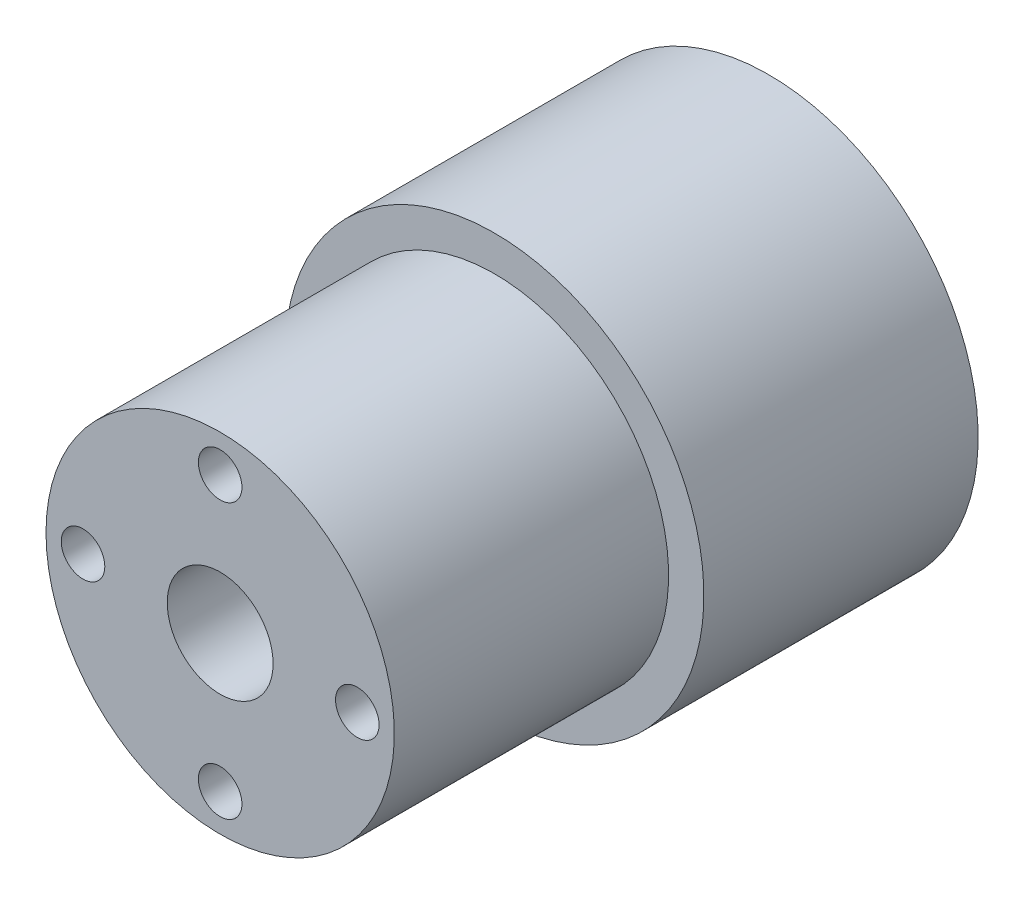
ISO-10303-21;
HEADER;
FILE_DESCRIPTION(('STEP AP214'),'2;1');
FILE_NAME('part.step','',(''),(''),'','','');
FILE_SCHEMA(('AUTOMOTIVE_DESIGN { 1 0 10303 214 1 1 1 1 }'));
ENDSEC;
DATA;
#1=APPLICATION_CONTEXT('core data for automotive mechanical design processes');
#2=APPLICATION_PROTOCOL_DEFINITION('international standard','automotive_design',2000,#1);
#3=PRODUCT_CONTEXT('',#1,'mechanical');
#4=PRODUCT('Part','Part','',(#3));
#5=PRODUCT_RELATED_PRODUCT_CATEGORY('part','',(#4));
#6=PRODUCT_DEFINITION_FORMATION('','',#4);
#7=PRODUCT_DEFINITION_CONTEXT('part definition',#1,'design');
#8=PRODUCT_DEFINITION('design','',#6,#7);
#9=PRODUCT_DEFINITION_SHAPE('','',#8);
#10=(LENGTH_UNIT() NAMED_UNIT(*) SI_UNIT(.MILLI.,.METRE.));
#11=(NAMED_UNIT(*) PLANE_ANGLE_UNIT() SI_UNIT($,.RADIAN.));
#12=(NAMED_UNIT(*) SI_UNIT($,.STERADIAN.) SOLID_ANGLE_UNIT());
#13=UNCERTAINTY_MEASURE_WITH_UNIT(LENGTH_MEASURE(1.E-05),#10,'distance_accuracy_value','');
#14=(GEOMETRIC_REPRESENTATION_CONTEXT(3) GLOBAL_UNCERTAINTY_ASSIGNED_CONTEXT((#13)) GLOBAL_UNIT_ASSIGNED_CONTEXT((#10,
#11,#12)) REPRESENTATION_CONTEXT('',''));
#15=CARTESIAN_POINT('',(0.,0.,0.));
#16=DIRECTION('',(0.,0.,1.));
#17=DIRECTION('',(1.,0.,0.));
#18=AXIS2_PLACEMENT_3D('',#15,#16,#17);
#19=CARTESIAN_POINT('',(0.,0.,0.));
#20=DIRECTION('',(0.,0.,-1.));
#21=DIRECTION('',(-1.,0.,0.));
#22=AXIS2_PLACEMENT_3D('',#19,#20,#21);
#23=PLANE('',#22);
#24=CARTESIAN_POINT('',(0.,0.,0.));
#25=DIRECTION('',(0.,0.,1.));
#26=DIRECTION('',(1.,0.,0.));
#27=AXIS2_PLACEMENT_3D('',#24,#25,#26);
#28=CIRCLE('',#27,2.8956);
#29=CARTESIAN_POINT('',(2.8956,0.,0.));
#30=VERTEX_POINT('',#29);
#31=EDGE_CURVE('E81',#30,#30,#28,.T.);
#32=ORIENTED_EDGE('',*,*,#31,.F.);
#33=EDGE_LOOP('',(#32));
#34=FACE_BOUND('',#33,.T.);
#35=CARTESIAN_POINT('',(-7.5,0.,0.));
#36=DIRECTION('',(0.,0.,1.));
#37=DIRECTION('',(1.,0.,0.));
#38=AXIS2_PLACEMENT_3D('',#35,#36,#37);
#39=CIRCLE('',#38,1.190625);
#40=CARTESIAN_POINT('',(-6.309375,0.,0.));
#41=VERTEX_POINT('',#40);
#42=EDGE_CURVE('E78',#41,#41,#39,.T.);
#43=ORIENTED_EDGE('',*,*,#42,.F.);
#44=EDGE_LOOP('',(#43));
#45=FACE_BOUND('',#44,.T.);
#46=CARTESIAN_POINT('',(0.,-7.5,0.));
#47=DIRECTION('',(0.,0.,1.));
#48=DIRECTION('',(1.,0.,0.));
#49=AXIS2_PLACEMENT_3D('',#46,#47,#48);
#50=CIRCLE('',#49,1.190625);
#51=CARTESIAN_POINT('',(1.190625,-7.5,0.));
#52=VERTEX_POINT('',#51);
#53=EDGE_CURVE('E70',#52,#52,#50,.T.);
#54=ORIENTED_EDGE('',*,*,#53,.F.);
#55=EDGE_LOOP('',(#54));
#56=FACE_BOUND('',#55,.T.);
#57=CARTESIAN_POINT('',(0.,7.5,0.));
#58=DIRECTION('',(0.,0.,1.));
#59=DIRECTION('',(1.,0.,0.));
#60=AXIS2_PLACEMENT_3D('',#57,#58,#59);
#61=CIRCLE('',#60,1.190625);
#62=CARTESIAN_POINT('',(1.190625,7.5,0.));
#63=VERTEX_POINT('',#62);
#64=EDGE_CURVE('E64',#63,#63,#61,.T.);
#65=ORIENTED_EDGE('',*,*,#64,.F.);
#66=EDGE_LOOP('',(#65));
#67=FACE_BOUND('',#66,.T.);
#68=CARTESIAN_POINT('',(7.5,0.,0.));
#69=DIRECTION('',(0.,0.,1.));
#70=DIRECTION('',(1.,0.,0.));
#71=AXIS2_PLACEMENT_3D('',#68,#69,#70);
#72=CIRCLE('',#71,1.190625);
#73=CARTESIAN_POINT('',(8.690625,0.,0.));
#74=VERTEX_POINT('',#73);
#75=EDGE_CURVE('E60',#74,#74,#72,.T.);
#76=ORIENTED_EDGE('',*,*,#75,.F.);
#77=EDGE_LOOP('',(#76));
#78=FACE_BOUND('',#77,.T.);
#79=CARTESIAN_POINT('',(0.,0.,0.));
#80=DIRECTION('',(0.,0.,-1.));
#81=DIRECTION('',(-1.,0.,0.));
#82=AXIS2_PLACEMENT_3D('',#79,#80,#81);
#83=CIRCLE('',#82,9.525);
#84=CARTESIAN_POINT('',(-9.525,0.,0.));
#85=VERTEX_POINT('',#84);
#86=EDGE_CURVE('E10',#85,#85,#83,.T.);
#87=ORIENTED_EDGE('',*,*,#86,.F.);
#88=EDGE_LOOP('',(#87));
#89=FACE_BOUND('',#88,.T.);
#90=ADVANCED_FACE('F40',(#34,#45,#56,#67,#78,#89),#23,.F.);
#91=CARTESIAN_POINT('',(0.,0.,-30.));
#92=DIRECTION('',(0.,0.,-1.));
#93=DIRECTION('',(-1.,0.,0.));
#94=AXIS2_PLACEMENT_3D('',#91,#92,#93);
#95=CYLINDRICAL_SURFACE('',#94,9.525);
#96=CARTESIAN_POINT('',(0.,0.,-15.));
#97=DIRECTION('',(0.,0.,-1.));
#98=DIRECTION('',(-1.,0.,0.));
#99=AXIS2_PLACEMENT_3D('',#96,#97,#98);
#100=CIRCLE('',#99,9.525);
#101=CARTESIAN_POINT('',(-9.525,0.,-15.));
#102=VERTEX_POINT('',#101);
#103=EDGE_CURVE('E43',#102,#102,#100,.T.);
#104=ORIENTED_EDGE('',*,*,#103,.F.);
#105=EDGE_LOOP('',(#104));
#106=FACE_BOUND('',#105,.T.);
#107=ORIENTED_EDGE('',*,*,#86,.T.);
#108=EDGE_LOOP('',(#107));
#109=FACE_BOUND('',#108,.T.);
#110=ADVANCED_FACE('F98',(#106,#109),#95,.T.);
#111=CARTESIAN_POINT('',(0.,9.525,-15.));
#112=DIRECTION('',(0.,0.,-1.));
#113=DIRECTION('',(-1.,0.,0.));
#114=AXIS2_PLACEMENT_3D('',#111,#112,#113);
#115=PLANE('',#114);
#116=CARTESIAN_POINT('',(0.,0.,-15.));
#117=DIRECTION('',(0.,0.,-1.));
#118=DIRECTION('',(-1.,0.,0.));
#119=AXIS2_PLACEMENT_3D('',#116,#117,#118);
#120=CIRCLE('',#119,11.455);
#121=CARTESIAN_POINT('',(-11.455,0.,-15.));
#122=VERTEX_POINT('',#121);
#123=EDGE_CURVE('E50',#122,#122,#120,.T.);
#124=ORIENTED_EDGE('',*,*,#123,.F.);
#125=EDGE_LOOP('',(#124));
#126=FACE_BOUND('',#125,.T.);
#127=ORIENTED_EDGE('',*,*,#103,.T.);
#128=EDGE_LOOP('',(#127));
#129=FACE_BOUND('',#128,.T.);
#130=ADVANCED_FACE('F129',(#126,#129),#115,.F.);
#131=CARTESIAN_POINT('',(0.,0.,-30.));
#132=DIRECTION('',(0.,0.,-1.));
#133=DIRECTION('',(-1.,0.,0.));
#134=AXIS2_PLACEMENT_3D('',#131,#132,#133);
#135=CYLINDRICAL_SURFACE('',#134,11.455);
#136=CARTESIAN_POINT('',(0.,0.,-30.));
#137=DIRECTION('',(0.,0.,-1.));
#138=DIRECTION('',(-1.,0.,0.));
#139=AXIS2_PLACEMENT_3D('',#136,#137,#138);
#140=CIRCLE('',#139,11.455);
#141=CARTESIAN_POINT('',(-11.455,0.,-30.));
#142=VERTEX_POINT('',#141);
#143=EDGE_CURVE('E51',#142,#142,#140,.T.);
#144=ORIENTED_EDGE('',*,*,#143,.F.);
#145=EDGE_LOOP('',(#144));
#146=FACE_BOUND('',#145,.T.);
#147=ORIENTED_EDGE('',*,*,#123,.T.);
#148=EDGE_LOOP('',(#147));
#149=FACE_BOUND('',#148,.T.);
#150=ADVANCED_FACE('F121',(#146,#149),#135,.T.);
#151=CARTESIAN_POINT('',(0.,11.455,-30.));
#152=DIRECTION('',(0.,0.,1.));
#153=DIRECTION('',(1.,0.,0.));
#154=AXIS2_PLACEMENT_3D('',#151,#152,#153);
#155=PLANE('',#154);
#156=ORIENTED_EDGE('',*,*,#143,.T.);
#157=EDGE_LOOP('',(#156));
#158=FACE_BOUND('',#157,.T.);
#159=ADVANCED_FACE('F112',(#158),#155,.F.);
#160=CARTESIAN_POINT('',(7.5,0.,-8.));
#161=DIRECTION('',(0.,0.,1.));
#162=DIRECTION('',(1.,0.,0.));
#163=AXIS2_PLACEMENT_3D('',#160,#161,#162);
#164=CYLINDRICAL_SURFACE('',#163,1.190625);
#165=CARTESIAN_POINT('',(7.5,0.,-8.));
#166=DIRECTION('',(0.,0.,1.));
#167=DIRECTION('',(1.,0.,0.));
#168=AXIS2_PLACEMENT_3D('',#165,#166,#167);
#169=CIRCLE('',#168,1.190625);
#170=CARTESIAN_POINT('',(8.690625,0.,-8.));
#171=VERTEX_POINT('',#170);
#172=EDGE_CURVE('E58',#171,#171,#169,.T.);
#173=ORIENTED_EDGE('',*,*,#172,.F.);
#174=EDGE_LOOP('',(#173));
#175=FACE_BOUND('',#174,.T.);
#176=ORIENTED_EDGE('',*,*,#75,.T.);
#177=EDGE_LOOP('',(#176));
#178=FACE_BOUND('',#177,.T.);
#179=ADVANCED_FACE('F107',(#175,#178),#164,.F.);
#180=CARTESIAN_POINT('',(0.,0.,-8.));
#181=DIRECTION('',(0.,0.,1.));
#182=DIRECTION('',(1.,0.,0.));
#183=AXIS2_PLACEMENT_3D('',#180,#181,#182);
#184=PLANE('',#183);
#185=ORIENTED_EDGE('',*,*,#172,.T.);
#186=EDGE_LOOP('',(#185));
#187=FACE_BOUND('',#186,.T.);
#188=ADVANCED_FACE('F109',(#187),#184,.T.);
#189=CARTESIAN_POINT('',(0.,7.5,-8.));
#190=DIRECTION('',(0.,0.,1.));
#191=DIRECTION('',(1.,0.,0.));
#192=AXIS2_PLACEMENT_3D('',#189,#190,#191);
#193=CYLINDRICAL_SURFACE('',#192,1.190625);
#194=CARTESIAN_POINT('',(0.,7.5,-8.));
#195=DIRECTION('',(0.,0.,1.));
#196=DIRECTION('',(1.,0.,0.));
#197=AXIS2_PLACEMENT_3D('',#194,#195,#196);
#198=CIRCLE('',#197,1.190625);
#199=CARTESIAN_POINT('',(1.190625,7.5,-8.));
#200=VERTEX_POINT('',#199);
#201=EDGE_CURVE('E67',#200,#200,#198,.T.);
#202=ORIENTED_EDGE('',*,*,#201,.F.);
#203=EDGE_LOOP('',(#202));
#204=FACE_BOUND('',#203,.T.);
#205=ORIENTED_EDGE('',*,*,#64,.T.);
#206=EDGE_LOOP('',(#205));
#207=FACE_BOUND('',#206,.T.);
#208=ADVANCED_FACE('F116',(#204,#207),#193,.F.);
#209=CARTESIAN_POINT('',(0.,0.,-8.));
#210=DIRECTION('',(0.,0.,1.));
#211=DIRECTION('',(1.,0.,0.));
#212=AXIS2_PLACEMENT_3D('',#209,#210,#211);
#213=PLANE('',#212);
#214=ORIENTED_EDGE('',*,*,#201,.T.);
#215=EDGE_LOOP('',(#214));
#216=FACE_BOUND('',#215,.T.);
#217=ADVANCED_FACE('F171',(#216),#213,.T.);
#218=CARTESIAN_POINT('',(0.,-7.5,-8.));
#219=DIRECTION('',(0.,0.,1.));
#220=DIRECTION('',(1.,0.,0.));
#221=AXIS2_PLACEMENT_3D('',#218,#219,#220);
#222=CYLINDRICAL_SURFACE('',#221,1.190625);
#223=CARTESIAN_POINT('',(0.,-7.5,-8.));
#224=DIRECTION('',(0.,0.,1.));
#225=DIRECTION('',(1.,0.,0.));
#226=AXIS2_PLACEMENT_3D('',#223,#224,#225);
#227=CIRCLE('',#226,1.190625);
#228=CARTESIAN_POINT('',(1.190625,-7.5,-8.));
#229=VERTEX_POINT('',#228);
#230=EDGE_CURVE('E71',#229,#229,#227,.T.);
#231=ORIENTED_EDGE('',*,*,#230,.F.);
#232=EDGE_LOOP('',(#231));
#233=FACE_BOUND('',#232,.T.);
#234=ORIENTED_EDGE('',*,*,#53,.T.);
#235=EDGE_LOOP('',(#234));
#236=FACE_BOUND('',#235,.T.);
#237=ADVANCED_FACE('F185',(#233,#236),#222,.F.);
#238=CARTESIAN_POINT('',(0.,0.,-8.));
#239=DIRECTION('',(0.,0.,1.));
#240=DIRECTION('',(1.,0.,0.));
#241=AXIS2_PLACEMENT_3D('',#238,#239,#240);
#242=PLANE('',#241);
#243=ORIENTED_EDGE('',*,*,#230,.T.);
#244=EDGE_LOOP('',(#243));
#245=FACE_BOUND('',#244,.T.);
#246=ADVANCED_FACE('F192',(#245),#242,.T.);
#247=CARTESIAN_POINT('',(-7.5,0.,-8.));
#248=DIRECTION('',(0.,0.,1.));
#249=DIRECTION('',(1.,0.,0.));
#250=AXIS2_PLACEMENT_3D('',#247,#248,#249);
#251=CYLINDRICAL_SURFACE('',#250,1.190625);
#252=CARTESIAN_POINT('',(-7.5,0.,-8.));
#253=DIRECTION('',(0.,0.,1.));
#254=DIRECTION('',(1.,0.,0.));
#255=AXIS2_PLACEMENT_3D('',#252,#253,#254);
#256=CIRCLE('',#255,1.190625);
#257=CARTESIAN_POINT('',(-6.309375,0.,-8.));
#258=VERTEX_POINT('',#257);
#259=EDGE_CURVE('E57',#258,#258,#256,.T.);
#260=ORIENTED_EDGE('',*,*,#259,.F.);
#261=EDGE_LOOP('',(#260));
#262=FACE_BOUND('',#261,.T.);
#263=ORIENTED_EDGE('',*,*,#42,.T.);
#264=EDGE_LOOP('',(#263));
#265=FACE_BOUND('',#264,.T.);
#266=ADVANCED_FACE('F205',(#262,#265),#251,.F.);
#267=CARTESIAN_POINT('',(0.,0.,-8.));
#268=DIRECTION('',(0.,0.,1.));
#269=DIRECTION('',(1.,0.,0.));
#270=AXIS2_PLACEMENT_3D('',#267,#268,#269);
#271=PLANE('',#270);
#272=ORIENTED_EDGE('',*,*,#259,.T.);
#273=EDGE_LOOP('',(#272));
#274=FACE_BOUND('',#273,.T.);
#275=ADVANCED_FACE('F95',(#274),#271,.T.);
#276=CARTESIAN_POINT('',(0.,0.,-16.));
#277=DIRECTION('',(0.,0.,1.));
#278=DIRECTION('',(1.,0.,0.));
#279=AXIS2_PLACEMENT_3D('',#276,#277,#278);
#280=CYLINDRICAL_SURFACE('',#279,2.8956);
#281=CARTESIAN_POINT('',(0.,0.,-16.));
#282=DIRECTION('',(0.,0.,1.));
#283=DIRECTION('',(1.,0.,0.));
#284=AXIS2_PLACEMENT_3D('',#281,#282,#283);
#285=CIRCLE('',#284,2.8956);
#286=CARTESIAN_POINT('',(2.8956,0.,-16.));
#287=VERTEX_POINT('',#286);
#288=EDGE_CURVE('E63',#287,#287,#285,.T.);
#289=ORIENTED_EDGE('',*,*,#288,.F.);
#290=EDGE_LOOP('',(#289));
#291=FACE_BOUND('',#290,.T.);
#292=ORIENTED_EDGE('',*,*,#31,.T.);
#293=EDGE_LOOP('',(#292));
#294=FACE_BOUND('',#293,.T.);
#295=ADVANCED_FACE('F90',(#291,#294),#280,.F.);
#296=CARTESIAN_POINT('',(0.,0.,-16.));
#297=DIRECTION('',(0.,0.,1.));
#298=DIRECTION('',(1.,0.,0.));
#299=AXIS2_PLACEMENT_3D('',#296,#297,#298);
#300=PLANE('',#299);
#301=ORIENTED_EDGE('',*,*,#288,.T.);
#302=EDGE_LOOP('',(#301));
#303=FACE_BOUND('',#302,.T.);
#304=ADVANCED_FACE('F87',(#303),#300,.T.);
#305=CLOSED_SHELL('',(#90,#110,#130,#150,#159,#179,#188,#208,#217,#237,#246,#266,#275,#295,#304));
#306=MANIFOLD_SOLID_BREP('B2',#305);
#307=ADVANCED_BREP_SHAPE_REPRESENTATION('',(#18,#306),#14);
#308=SHAPE_DEFINITION_REPRESENTATION(#9,#307);
ENDSEC;
END-ISO-10303-21;
